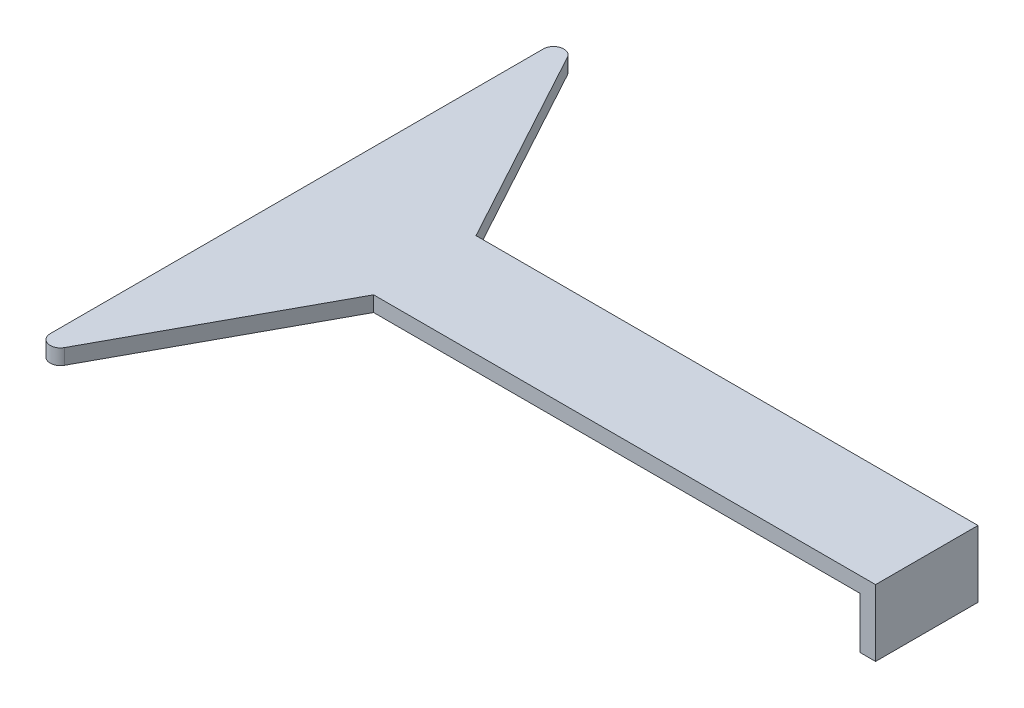
ISO-10303-21;
HEADER;
FILE_DESCRIPTION(('STEP AP214'),'2;1');
FILE_NAME('part.step','',(''),(''),'','','');
FILE_SCHEMA(('AUTOMOTIVE_DESIGN { 1 0 10303 214 1 1 1 1 }'));
ENDSEC;
DATA;
#1=APPLICATION_CONTEXT('core data for automotive mechanical design processes');
#2=APPLICATION_PROTOCOL_DEFINITION('international standard','automotive_design',2000,#1);
#3=PRODUCT_CONTEXT('',#1,'mechanical');
#4=PRODUCT('Part','Part','',(#3));
#5=PRODUCT_RELATED_PRODUCT_CATEGORY('part','',(#4));
#6=PRODUCT_DEFINITION_FORMATION('','',#4);
#7=PRODUCT_DEFINITION_CONTEXT('part definition',#1,'design');
#8=PRODUCT_DEFINITION('design','',#6,#7);
#9=PRODUCT_DEFINITION_SHAPE('','',#8);
#10=(LENGTH_UNIT() NAMED_UNIT(*) SI_UNIT(.MILLI.,.METRE.));
#11=(NAMED_UNIT(*) PLANE_ANGLE_UNIT() SI_UNIT($,.RADIAN.));
#12=(NAMED_UNIT(*) SI_UNIT($,.STERADIAN.) SOLID_ANGLE_UNIT());
#13=UNCERTAINTY_MEASURE_WITH_UNIT(LENGTH_MEASURE(1.E-05),#10,'distance_accuracy_value','');
#14=(GEOMETRIC_REPRESENTATION_CONTEXT(3) GLOBAL_UNCERTAINTY_ASSIGNED_CONTEXT((#13)) GLOBAL_UNIT_ASSIGNED_CONTEXT((#10,
#11,#12)) REPRESENTATION_CONTEXT('',''));
#15=CARTESIAN_POINT('',(0.,0.,0.));
#16=DIRECTION('',(0.,0.,1.));
#17=DIRECTION('',(1.,0.,0.));
#18=AXIS2_PLACEMENT_3D('',#15,#16,#17);
#19=CARTESIAN_POINT('',(0.,0.,0.));
#20=DIRECTION('',(0.,-1.,0.));
#21=DIRECTION('',(0.,0.,-1.));
#22=AXIS2_PLACEMENT_3D('',#19,#20,#21);
#23=PLANE('',#22);
#24=DIRECTION('',(0.,0.,1.));
#25=VECTOR('',#24,1.);
#26=CARTESIAN_POINT('',(-120.,0.,20.));
#27=LINE('',#26,#25);
#28=CARTESIAN_POINT('',(-120.,0.,-38.1316351639333));
#29=VERTEX_POINT('',#28);
#30=CARTESIAN_POINT('',(-120.,0.,58.1316351639333));
#31=VERTEX_POINT('',#30);
#32=EDGE_CURVE('E260',#29,#31,#27,.T.);
#33=ORIENTED_EDGE('',*,*,#32,.F.);
#34=CARTESIAN_POINT('',(-118.,0.,-38.1316351639333));
#35=DIRECTION('',(0.,1.,0.));
#36=DIRECTION('',(0.,0.,-1.));
#37=AXIS2_PLACEMENT_3D('',#34,#35,#36);
#38=CIRCLE('',#37,2.);
#39=CARTESIAN_POINT('',(-116.242750980855,0.,-39.086661804773));
#40=VERTEX_POINT('',#39);
#41=EDGE_CURVE('E183',#40,#29,#38,.T.);
#42=ORIENTED_EDGE('',*,*,#41,.F.);
#43=DIRECTION('',(-0.477513320419862,0.,-0.878624509572547));
#44=VECTOR('',#43,1.);
#45=CARTESIAN_POINT('',(-116.242750980855,0.,-39.086661804773));
#46=LINE('',#45,#44);
#47=CARTESIAN_POINT('',(-95.,0.,0.));
#48=VERTEX_POINT('',#47);
#49=EDGE_CURVE('E179',#48,#40,#46,.T.);
#50=ORIENTED_EDGE('',*,*,#49,.F.);
#51=DIRECTION('',(-1.,0.,0.));
#52=VECTOR('',#51,1.);
#53=CARTESIAN_POINT('',(-120.,0.,0.));
#54=LINE('',#53,#52);
#55=CARTESIAN_POINT('',(0.,0.,0.));
#56=VERTEX_POINT('',#55);
#57=EDGE_CURVE('E43',#56,#48,#54,.T.);
#58=ORIENTED_EDGE('',*,*,#57,.F.);
#59=DIRECTION('',(0.,0.,-1.));
#60=VECTOR('',#59,1.);
#61=CARTESIAN_POINT('',(0.,0.,20.));
#62=LINE('',#61,#60);
#63=CARTESIAN_POINT('',(0.,0.,20.));
#64=VERTEX_POINT('',#63);
#65=EDGE_CURVE('E270',#64,#56,#62,.T.);
#66=ORIENTED_EDGE('',*,*,#65,.F.);
#67=DIRECTION('',(1.,0.,0.));
#68=VECTOR('',#67,1.);
#69=CARTESIAN_POINT('',(-120.,0.,20.));
#70=LINE('',#69,#68);
#71=CARTESIAN_POINT('',(-95.,0.,20.));
#72=VERTEX_POINT('',#71);
#73=EDGE_CURVE('E268',#72,#64,#70,.T.);
#74=ORIENTED_EDGE('',*,*,#73,.F.);
#75=DIRECTION('',(0.477513320419862,0.,-0.878624509572547));
#76=VECTOR('',#75,1.);
#77=CARTESIAN_POINT('',(-116.242750980855,0.,59.086661804773));
#78=LINE('',#77,#76);
#79=CARTESIAN_POINT('',(-116.242750980855,0.,59.086661804773));
#80=VERTEX_POINT('',#79);
#81=EDGE_CURVE('E205',#80,#72,#78,.T.);
#82=ORIENTED_EDGE('',*,*,#81,.F.);
#83=CARTESIAN_POINT('',(-118.,0.,58.1316351639333));
#84=DIRECTION('',(0.,1.,0.));
#85=DIRECTION('',(0.,0.,1.));
#86=AXIS2_PLACEMENT_3D('',#83,#84,#85);
#87=CIRCLE('',#86,2.00000000000001);
#88=EDGE_CURVE('E201',#31,#80,#87,.T.);
#89=ORIENTED_EDGE('',*,*,#88,.F.);
#90=EDGE_LOOP('',(#33,#42,#50,#58,#66,#74,#82,#89));
#91=FACE_BOUND('',#90,.T.);
#92=DIRECTION('',(-1.,0.,0.));
#93=VECTOR('',#92,1.);
#94=CARTESIAN_POINT('',(-55.,0.,12.5));
#95=LINE('',#94,#93);
#96=CARTESIAN_POINT('',(-55.,0.,12.5));
#97=VERTEX_POINT('',#96);
#98=CARTESIAN_POINT('',(-75.,0.,12.5));
#99=VERTEX_POINT('',#98);
#100=EDGE_CURVE('E488',#97,#99,#95,.T.);
#101=ORIENTED_EDGE('',*,*,#100,.F.);
#102=CARTESIAN_POINT('',(-55.,0.,10.));
#103=DIRECTION('',(0.,-1.,0.));
#104=DIRECTION('',(0.,0.,-1.));
#105=AXIS2_PLACEMENT_3D('',#102,#103,#104);
#106=CIRCLE('',#105,2.5);
#107=CARTESIAN_POINT('',(-55.,0.,7.50000000000001));
#108=VERTEX_POINT('',#107);
#109=EDGE_CURVE('E168',#108,#97,#106,.T.);
#110=ORIENTED_EDGE('',*,*,#109,.F.);
#111=DIRECTION('',(1.,0.,0.));
#112=VECTOR('',#111,1.);
#113=CARTESIAN_POINT('',(-55.,0.,7.50000000000001));
#114=LINE('',#113,#112);
#115=CARTESIAN_POINT('',(-75.,0.,7.50000000000001));
#116=VERTEX_POINT('',#115);
#117=EDGE_CURVE('E164',#116,#108,#114,.T.);
#118=ORIENTED_EDGE('',*,*,#117,.F.);
#119=CARTESIAN_POINT('',(-75.,0.,10.));
#120=DIRECTION('',(0.,-1.,0.));
#121=DIRECTION('',(0.,0.,-1.));
#122=AXIS2_PLACEMENT_3D('',#119,#120,#121);
#123=CIRCLE('',#122,2.5);
#124=EDGE_CURVE('E484',#99,#116,#123,.T.);
#125=ORIENTED_EDGE('',*,*,#124,.F.);
#126=EDGE_LOOP('',(#101,#110,#118,#125));
#127=FACE_BOUND('',#126,.T.);
#128=ADVANCED_FACE('F39',(#91,#127),#23,.T.);
#129=CARTESIAN_POINT('',(-120.,3.,20.));
#130=DIRECTION('',(0.,0.,-1.));
#131=DIRECTION('',(-1.,0.,0.));
#132=AXIS2_PLACEMENT_3D('',#129,#130,#131);
#133=PLANE('',#132);
#134=DIRECTION('',(0.,1.,0.));
#135=VECTOR('',#134,1.);
#136=CARTESIAN_POINT('',(-95.,0.,20.));
#137=LINE('',#136,#135);
#138=CARTESIAN_POINT('',(-95.,3.,20.));
#139=VERTEX_POINT('',#138);
#140=EDGE_CURVE('E217',#72,#139,#137,.T.);
#141=ORIENTED_EDGE('',*,*,#140,.F.);
#142=ORIENTED_EDGE('',*,*,#73,.T.);
#143=DIRECTION('',(0.,-1.,0.));
#144=VECTOR('',#143,1.);
#145=CARTESIAN_POINT('',(0.,3.,20.));
#146=LINE('',#145,#144);
#147=CARTESIAN_POINT('',(0.,-10.,20.));
#148=VERTEX_POINT('',#147);
#149=EDGE_CURVE('E221',#64,#148,#146,.T.);
#150=ORIENTED_EDGE('',*,*,#149,.T.);
#151=DIRECTION('',(-1.,0.,0.));
#152=VECTOR('',#151,1.);
#153=CARTESIAN_POINT('',(3.,-10.,20.));
#154=LINE('',#153,#152);
#155=CARTESIAN_POINT('',(3.,-10.,20.));
#156=VERTEX_POINT('',#155);
#157=EDGE_CURVE('E256',#156,#148,#154,.T.);
#158=ORIENTED_EDGE('',*,*,#157,.F.);
#159=DIRECTION('',(0.,-1.,0.));
#160=VECTOR('',#159,1.);
#161=CARTESIAN_POINT('',(3.,3.,20.));
#162=LINE('',#161,#160);
#163=CARTESIAN_POINT('',(3.,3.,20.));
#164=VERTEX_POINT('',#163);
#165=EDGE_CURVE('E228',#164,#156,#162,.T.);
#166=ORIENTED_EDGE('',*,*,#165,.F.);
#167=DIRECTION('',(1.,0.,0.));
#168=VECTOR('',#167,1.);
#169=CARTESIAN_POINT('',(-120.,3.,20.));
#170=LINE('',#169,#168);
#171=EDGE_CURVE('E49',#139,#164,#170,.T.);
#172=ORIENTED_EDGE('',*,*,#171,.F.);
#173=EDGE_LOOP('',(#141,#142,#150,#158,#166,#172));
#174=FACE_BOUND('',#173,.T.);
#175=ADVANCED_FACE('F305',(#174),#133,.F.);
#176=CARTESIAN_POINT('',(-120.,3.,20.));
#177=DIRECTION('',(1.,0.,0.));
#178=DIRECTION('',(0.,0.,-1.));
#179=AXIS2_PLACEMENT_3D('',#176,#177,#178);
#180=PLANE('',#179);
#181=ORIENTED_EDGE('',*,*,#32,.T.);
#182=DIRECTION('',(0.,1.,0.));
#183=VECTOR('',#182,1.);
#184=CARTESIAN_POINT('',(-120.,0.,58.1316351639333));
#185=LINE('',#184,#183);
#186=CARTESIAN_POINT('',(-120.,3.,58.1316351639333));
#187=VERTEX_POINT('',#186);
#188=EDGE_CURVE('E210',#31,#187,#185,.T.);
#189=ORIENTED_EDGE('',*,*,#188,.T.);
#190=DIRECTION('',(0.,0.,1.));
#191=VECTOR('',#190,1.);
#192=CARTESIAN_POINT('',(-120.,3.,20.));
#193=LINE('',#192,#191);
#194=CARTESIAN_POINT('',(-120.,3.,-38.1316351639333));
#195=VERTEX_POINT('',#194);
#196=EDGE_CURVE('E261',#195,#187,#193,.T.);
#197=ORIENTED_EDGE('',*,*,#196,.F.);
#198=DIRECTION('',(0.,1.,0.));
#199=VECTOR('',#198,1.);
#200=CARTESIAN_POINT('',(-120.,0.,-38.1316351639333));
#201=LINE('',#200,#199);
#202=EDGE_CURVE('E191',#29,#195,#201,.T.);
#203=ORIENTED_EDGE('',*,*,#202,.F.);
#204=EDGE_LOOP('',(#181,#189,#197,#203));
#205=FACE_BOUND('',#204,.T.);
#206=ADVANCED_FACE('F41',(#205),#180,.F.);
#207=CARTESIAN_POINT('',(-120.,3.,0.));
#208=DIRECTION('',(0.,0.,1.));
#209=DIRECTION('',(1.,0.,0.));
#210=AXIS2_PLACEMENT_3D('',#207,#208,#209);
#211=PLANE('',#210);
#212=ORIENTED_EDGE('',*,*,#57,.T.);
#213=DIRECTION('',(0.,1.,0.));
#214=VECTOR('',#213,1.);
#215=CARTESIAN_POINT('',(-95.,0.,0.));
#216=LINE('',#215,#214);
#217=CARTESIAN_POINT('',(-95.,3.,0.));
#218=VERTEX_POINT('',#217);
#219=EDGE_CURVE('E186',#48,#218,#216,.T.);
#220=ORIENTED_EDGE('',*,*,#219,.T.);
#221=DIRECTION('',(-1.,0.,0.));
#222=VECTOR('',#221,1.);
#223=CARTESIAN_POINT('',(-120.,3.,0.));
#224=LINE('',#223,#222);
#225=CARTESIAN_POINT('',(3.,3.,0.));
#226=VERTEX_POINT('',#225);
#227=EDGE_CURVE('E11',#226,#218,#224,.T.);
#228=ORIENTED_EDGE('',*,*,#227,.F.);
#229=DIRECTION('',(0.,1.,0.));
#230=VECTOR('',#229,1.);
#231=CARTESIAN_POINT('',(3.,3.,0.));
#232=LINE('',#231,#230);
#233=CARTESIAN_POINT('',(3.,-10.,0.));
#234=VERTEX_POINT('',#233);
#235=EDGE_CURVE('E236',#234,#226,#232,.T.);
#236=ORIENTED_EDGE('',*,*,#235,.F.);
#237=DIRECTION('',(-1.,0.,0.));
#238=VECTOR('',#237,1.);
#239=CARTESIAN_POINT('',(3.,-10.,0.));
#240=LINE('',#239,#238);
#241=CARTESIAN_POINT('',(0.,-10.,0.));
#242=VERTEX_POINT('',#241);
#243=EDGE_CURVE('E244',#234,#242,#240,.T.);
#244=ORIENTED_EDGE('',*,*,#243,.T.);
#245=DIRECTION('',(0.,1.,0.));
#246=VECTOR('',#245,1.);
#247=CARTESIAN_POINT('',(0.,3.,0.));
#248=LINE('',#247,#246);
#249=EDGE_CURVE('E233',#242,#56,#248,.T.);
#250=ORIENTED_EDGE('',*,*,#249,.T.);
#251=EDGE_LOOP('',(#212,#220,#228,#236,#244,#250));
#252=FACE_BOUND('',#251,.T.);
#253=ADVANCED_FACE('F280',(#252),#211,.F.);
#254=CARTESIAN_POINT('',(0.,3.,0.));
#255=DIRECTION('',(0.,-1.,0.));
#256=DIRECTION('',(0.,0.,-1.));
#257=AXIS2_PLACEMENT_3D('',#254,#255,#256);
#258=PLANE('',#257);
#259=ORIENTED_EDGE('',*,*,#196,.T.);
#260=CARTESIAN_POINT('',(-118.,3.,58.1316351639333));
#261=DIRECTION('',(0.,1.,0.));
#262=DIRECTION('',(0.,0.,1.));
#263=AXIS2_PLACEMENT_3D('',#260,#261,#262);
#264=CIRCLE('',#263,2.00000000000001);
#265=CARTESIAN_POINT('',(-116.242750980855,3.,59.086661804773));
#266=VERTEX_POINT('',#265);
#267=EDGE_CURVE('E195',#187,#266,#264,.T.);
#268=ORIENTED_EDGE('',*,*,#267,.T.);
#269=DIRECTION('',(0.477513320419862,0.,-0.878624509572547));
#270=VECTOR('',#269,1.);
#271=CARTESIAN_POINT('',(-116.242750980855,3.,59.086661804773));
#272=LINE('',#271,#270);
#273=EDGE_CURVE('E206',#266,#139,#272,.T.);
#274=ORIENTED_EDGE('',*,*,#273,.T.);
#275=ORIENTED_EDGE('',*,*,#171,.T.);
#276=DIRECTION('',(0.,0.,1.));
#277=VECTOR('',#276,1.);
#278=CARTESIAN_POINT('',(3.,3.,20.));
#279=LINE('',#278,#277);
#280=EDGE_CURVE('E240',#226,#164,#279,.T.);
#281=ORIENTED_EDGE('',*,*,#280,.F.);
#282=ORIENTED_EDGE('',*,*,#227,.T.);
#283=DIRECTION('',(-0.477513320419862,0.,-0.878624509572547));
#284=VECTOR('',#283,1.);
#285=CARTESIAN_POINT('',(-116.242750980855,3.,-39.086661804773));
#286=LINE('',#285,#284);
#287=CARTESIAN_POINT('',(-116.242750980855,3.,-39.086661804773));
#288=VERTEX_POINT('',#287);
#289=EDGE_CURVE('E65',#218,#288,#286,.T.);
#290=ORIENTED_EDGE('',*,*,#289,.T.);
#291=CARTESIAN_POINT('',(-118.,3.,-38.1316351639333));
#292=DIRECTION('',(0.,1.,0.));
#293=DIRECTION('',(0.,0.,-1.));
#294=AXIS2_PLACEMENT_3D('',#291,#292,#293);
#295=CIRCLE('',#294,2.);
#296=EDGE_CURVE('E174',#288,#195,#295,.T.);
#297=ORIENTED_EDGE('',*,*,#296,.T.);
#298=EDGE_LOOP('',(#259,#268,#274,#275,#281,#282,#290,#297));
#299=FACE_BOUND('',#298,.T.);
#300=ADVANCED_FACE('F292',(#299),#258,.F.);
#301=CARTESIAN_POINT('',(0.,0.,0.));
#302=DIRECTION('',(1.,0.,0.));
#303=DIRECTION('',(0.,0.,-1.));
#304=AXIS2_PLACEMENT_3D('',#301,#302,#303);
#305=PLANE('',#304);
#306=ORIENTED_EDGE('',*,*,#149,.F.);
#307=ORIENTED_EDGE('',*,*,#65,.T.);
#308=ORIENTED_EDGE('',*,*,#249,.F.);
#309=DIRECTION('',(0.,0.,-1.));
#310=VECTOR('',#309,1.);
#311=CARTESIAN_POINT('',(0.,-10.,20.));
#312=LINE('',#311,#310);
#313=EDGE_CURVE('E247',#148,#242,#312,.T.);
#314=ORIENTED_EDGE('',*,*,#313,.F.);
#315=EDGE_LOOP('',(#306,#307,#308,#314));
#316=FACE_BOUND('',#315,.T.);
#317=ADVANCED_FACE('F303',(#316),#305,.F.);
#318=CARTESIAN_POINT('',(3.,-10.,20.));
#319=DIRECTION('',(0.,1.,0.));
#320=DIRECTION('',(0.,0.,1.));
#321=AXIS2_PLACEMENT_3D('',#318,#319,#320);
#322=PLANE('',#321);
#323=ORIENTED_EDGE('',*,*,#313,.T.);
#324=ORIENTED_EDGE('',*,*,#243,.F.);
#325=DIRECTION('',(0.,0.,-1.));
#326=VECTOR('',#325,1.);
#327=CARTESIAN_POINT('',(3.,-10.,20.));
#328=LINE('',#327,#326);
#329=EDGE_CURVE('E232',#156,#234,#328,.T.);
#330=ORIENTED_EDGE('',*,*,#329,.F.);
#331=ORIENTED_EDGE('',*,*,#157,.T.);
#332=EDGE_LOOP('',(#323,#324,#330,#331));
#333=FACE_BOUND('',#332,.T.);
#334=ADVANCED_FACE('F301',(#333),#322,.F.);
#335=CARTESIAN_POINT('',(3.,0.,0.));
#336=DIRECTION('',(1.,0.,0.));
#337=DIRECTION('',(0.,0.,-1.));
#338=AXIS2_PLACEMENT_3D('',#335,#336,#337);
#339=PLANE('',#338);
#340=ORIENTED_EDGE('',*,*,#165,.T.);
#341=ORIENTED_EDGE('',*,*,#329,.T.);
#342=ORIENTED_EDGE('',*,*,#235,.T.);
#343=ORIENTED_EDGE('',*,*,#280,.T.);
#344=EDGE_LOOP('',(#340,#341,#342,#343));
#345=FACE_BOUND('',#344,.T.);
#346=ADVANCED_FACE('F296',(#345),#339,.T.);
#347=CARTESIAN_POINT('',(-116.242750980855,0.,59.086661804773));
#348=DIRECTION('',(0.878624509572547,0.,0.477513320419862));
#349=DIRECTION('',(0.477513320419862,0.,-0.878624509572547));
#350=AXIS2_PLACEMENT_3D('',#347,#348,#349);
#351=PLANE('',#350);
#352=ORIENTED_EDGE('',*,*,#273,.F.);
#353=DIRECTION('',(0.,1.,0.));
#354=VECTOR('',#353,1.);
#355=CARTESIAN_POINT('',(-116.242750980855,0.,59.086661804773));
#356=LINE('',#355,#354);
#357=EDGE_CURVE('E222',#80,#266,#356,.T.);
#358=ORIENTED_EDGE('',*,*,#357,.F.);
#359=ORIENTED_EDGE('',*,*,#81,.T.);
#360=ORIENTED_EDGE('',*,*,#140,.T.);
#361=EDGE_LOOP('',(#352,#358,#359,#360));
#362=FACE_BOUND('',#361,.T.);
#363=ADVANCED_FACE('F310',(#362),#351,.T.);
#364=CARTESIAN_POINT('',(-118.,0.,58.1316351639333));
#365=DIRECTION('',(0.,1.,0.));
#366=DIRECTION('',(0.,0.,1.));
#367=AXIS2_PLACEMENT_3D('',#364,#365,#366);
#368=CYLINDRICAL_SURFACE('',#367,2.00000000000001);
#369=ORIENTED_EDGE('',*,*,#267,.F.);
#370=ORIENTED_EDGE('',*,*,#188,.F.);
#371=ORIENTED_EDGE('',*,*,#88,.T.);
#372=ORIENTED_EDGE('',*,*,#357,.T.);
#373=EDGE_LOOP('',(#369,#370,#371,#372));
#374=FACE_BOUND('',#373,.T.);
#375=ADVANCED_FACE('F314',(#374),#368,.T.);
#376=CARTESIAN_POINT('',(-118.,0.,-38.1316351639333));
#377=DIRECTION('',(0.,1.,0.));
#378=DIRECTION('',(0.,0.,1.));
#379=AXIS2_PLACEMENT_3D('',#376,#377,#378);
#380=CYLINDRICAL_SURFACE('',#379,2.);
#381=ORIENTED_EDGE('',*,*,#296,.F.);
#382=DIRECTION('',(0.,1.,0.));
#383=VECTOR('',#382,1.);
#384=CARTESIAN_POINT('',(-116.242750980855,0.,-39.086661804773));
#385=LINE('',#384,#383);
#386=EDGE_CURVE('E196',#40,#288,#385,.T.);
#387=ORIENTED_EDGE('',*,*,#386,.F.);
#388=ORIENTED_EDGE('',*,*,#41,.T.);
#389=ORIENTED_EDGE('',*,*,#202,.T.);
#390=EDGE_LOOP('',(#381,#387,#388,#389));
#391=FACE_BOUND('',#390,.T.);
#392=ADVANCED_FACE('F289',(#391),#380,.T.);
#393=CARTESIAN_POINT('',(-116.242750980855,0.,-39.086661804773));
#394=DIRECTION('',(0.878624509572546,0.,-0.477513320419862));
#395=DIRECTION('',(-0.477513320419862,0.,-0.878624509572547));
#396=AXIS2_PLACEMENT_3D('',#393,#394,#395);
#397=PLANE('',#396);
#398=ORIENTED_EDGE('',*,*,#289,.F.);
#399=ORIENTED_EDGE('',*,*,#219,.F.);
#400=ORIENTED_EDGE('',*,*,#49,.T.);
#401=ORIENTED_EDGE('',*,*,#386,.T.);
#402=EDGE_LOOP('',(#398,#399,#400,#401));
#403=FACE_BOUND('',#402,.T.);
#404=ADVANCED_FACE('F286',(#403),#397,.T.);
#405=CARTESIAN_POINT('',(-55.,-3.,10.));
#406=DIRECTION('',(0.,1.,0.));
#407=DIRECTION('',(0.,0.,1.));
#408=AXIS2_PLACEMENT_3D('',#405,#406,#407);
#409=CYLINDRICAL_SURFACE('',#408,2.5);
#410=ORIENTED_EDGE('',*,*,#109,.T.);
#411=DIRECTION('',(0.,1.,0.));
#412=VECTOR('',#411,1.);
#413=CARTESIAN_POINT('',(-55.,-3.,12.5));
#414=LINE('',#413,#412);
#415=CARTESIAN_POINT('',(-55.,-3.,12.5));
#416=VERTEX_POINT('',#415);
#417=EDGE_CURVE('E147',#416,#97,#414,.T.);
#418=ORIENTED_EDGE('',*,*,#417,.F.);
#419=CARTESIAN_POINT('',(-55.,-3.,10.));
#420=DIRECTION('',(0.,-1.,0.));
#421=DIRECTION('',(0.,0.,-1.));
#422=AXIS2_PLACEMENT_3D('',#419,#420,#421);
#423=CIRCLE('',#422,2.5);
#424=CARTESIAN_POINT('',(-55.,-3.,7.50000000000001));
#425=VERTEX_POINT('',#424);
#426=EDGE_CURVE('E155',#425,#416,#423,.T.);
#427=ORIENTED_EDGE('',*,*,#426,.F.);
#428=DIRECTION('',(0.,1.,0.));
#429=VECTOR('',#428,1.);
#430=CARTESIAN_POINT('',(-55.,-3.,7.50000000000001));
#431=LINE('',#430,#429);
#432=EDGE_CURVE('E481',#425,#108,#431,.T.);
#433=ORIENTED_EDGE('',*,*,#432,.T.);
#434=EDGE_LOOP('',(#410,#418,#427,#433));
#435=FACE_BOUND('',#434,.T.);
#436=ADVANCED_FACE('F166',(#435),#409,.T.);
#437=CARTESIAN_POINT('',(-55.,-3.,12.5));
#438=DIRECTION('',(0.,0.,-1.));
#439=DIRECTION('',(-1.,0.,0.));
#440=AXIS2_PLACEMENT_3D('',#437,#438,#439);
#441=PLANE('',#440);
#442=ORIENTED_EDGE('',*,*,#100,.T.);
#443=DIRECTION('',(0.,1.,0.));
#444=VECTOR('',#443,1.);
#445=CARTESIAN_POINT('',(-75.,-3.,12.5));
#446=LINE('',#445,#444);
#447=CARTESIAN_POINT('',(-75.,-3.,12.5));
#448=VERTEX_POINT('',#447);
#449=EDGE_CURVE('E150',#448,#99,#446,.T.);
#450=ORIENTED_EDGE('',*,*,#449,.F.);
#451=DIRECTION('',(-1.,0.,0.));
#452=VECTOR('',#451,1.);
#453=CARTESIAN_POINT('',(-55.,-3.,12.5));
#454=LINE('',#453,#452);
#455=EDGE_CURVE('E143',#416,#448,#454,.T.);
#456=ORIENTED_EDGE('',*,*,#455,.F.);
#457=ORIENTED_EDGE('',*,*,#417,.T.);
#458=EDGE_LOOP('',(#442,#450,#456,#457));
#459=FACE_BOUND('',#458,.T.);
#460=ADVANCED_FACE('F145',(#459),#441,.F.);
#461=CARTESIAN_POINT('',(-75.,-3.,10.));
#462=DIRECTION('',(0.,1.,0.));
#463=DIRECTION('',(0.,0.,1.));
#464=AXIS2_PLACEMENT_3D('',#461,#462,#463);
#465=CYLINDRICAL_SURFACE('',#464,2.5);
#466=ORIENTED_EDGE('',*,*,#124,.T.);
#467=DIRECTION('',(0.,1.,0.));
#468=VECTOR('',#467,1.);
#469=CARTESIAN_POINT('',(-75.,-3.,7.50000000000001));
#470=LINE('',#469,#468);
#471=CARTESIAN_POINT('',(-75.,-3.,7.50000000000001));
#472=VERTEX_POINT('',#471);
#473=EDGE_CURVE('E57',#472,#116,#470,.T.);
#474=ORIENTED_EDGE('',*,*,#473,.F.);
#475=CARTESIAN_POINT('',(-75.,-3.,10.));
#476=DIRECTION('',(0.,-1.,0.));
#477=DIRECTION('',(0.,0.,-1.));
#478=AXIS2_PLACEMENT_3D('',#475,#476,#477);
#479=CIRCLE('',#478,2.5);
#480=EDGE_CURVE('E154',#448,#472,#479,.T.);
#481=ORIENTED_EDGE('',*,*,#480,.F.);
#482=ORIENTED_EDGE('',*,*,#449,.T.);
#483=EDGE_LOOP('',(#466,#474,#481,#482));
#484=FACE_BOUND('',#483,.T.);
#485=ADVANCED_FACE('F347',(#484),#465,.T.);
#486=CARTESIAN_POINT('',(-55.,-3.,7.50000000000001));
#487=DIRECTION('',(0.,0.,1.));
#488=DIRECTION('',(1.,0.,0.));
#489=AXIS2_PLACEMENT_3D('',#486,#487,#488);
#490=PLANE('',#489);
#491=ORIENTED_EDGE('',*,*,#117,.T.);
#492=ORIENTED_EDGE('',*,*,#432,.F.);
#493=DIRECTION('',(1.,0.,0.));
#494=VECTOR('',#493,1.);
#495=CARTESIAN_POINT('',(-55.,-3.,7.50000000000001));
#496=LINE('',#495,#494);
#497=EDGE_CURVE('E159',#472,#425,#496,.T.);
#498=ORIENTED_EDGE('',*,*,#497,.F.);
#499=ORIENTED_EDGE('',*,*,#473,.T.);
#500=EDGE_LOOP('',(#491,#492,#498,#499));
#501=FACE_BOUND('',#500,.T.);
#502=ADVANCED_FACE('F350',(#501),#490,.F.);
#503=CARTESIAN_POINT('',(-55.,-3.,10.));
#504=DIRECTION('',(0.,-1.,0.));
#505=DIRECTION('',(0.,0.,-1.));
#506=AXIS2_PLACEMENT_3D('',#503,#504,#505);
#507=PLANE('',#506);
#508=ORIENTED_EDGE('',*,*,#426,.T.);
#509=ORIENTED_EDGE('',*,*,#455,.T.);
#510=ORIENTED_EDGE('',*,*,#480,.T.);
#511=ORIENTED_EDGE('',*,*,#497,.T.);
#512=EDGE_LOOP('',(#508,#509,#510,#511));
#513=FACE_BOUND('',#512,.T.);
#514=ADVANCED_FACE('F158',(#513),#507,.T.);
#515=CLOSED_SHELL('',(#128,#175,#206,#253,#300,#317,#334,#346,#363,#375,#392,#404,#436,#460,
#485,#502,#514));
#516=MANIFOLD_SOLID_BREP('B2',#515);
#517=ADVANCED_BREP_SHAPE_REPRESENTATION('',(#18,#516),#14);
#518=SHAPE_DEFINITION_REPRESENTATION(#9,#517);
ENDSEC;
END-ISO-10303-21;
